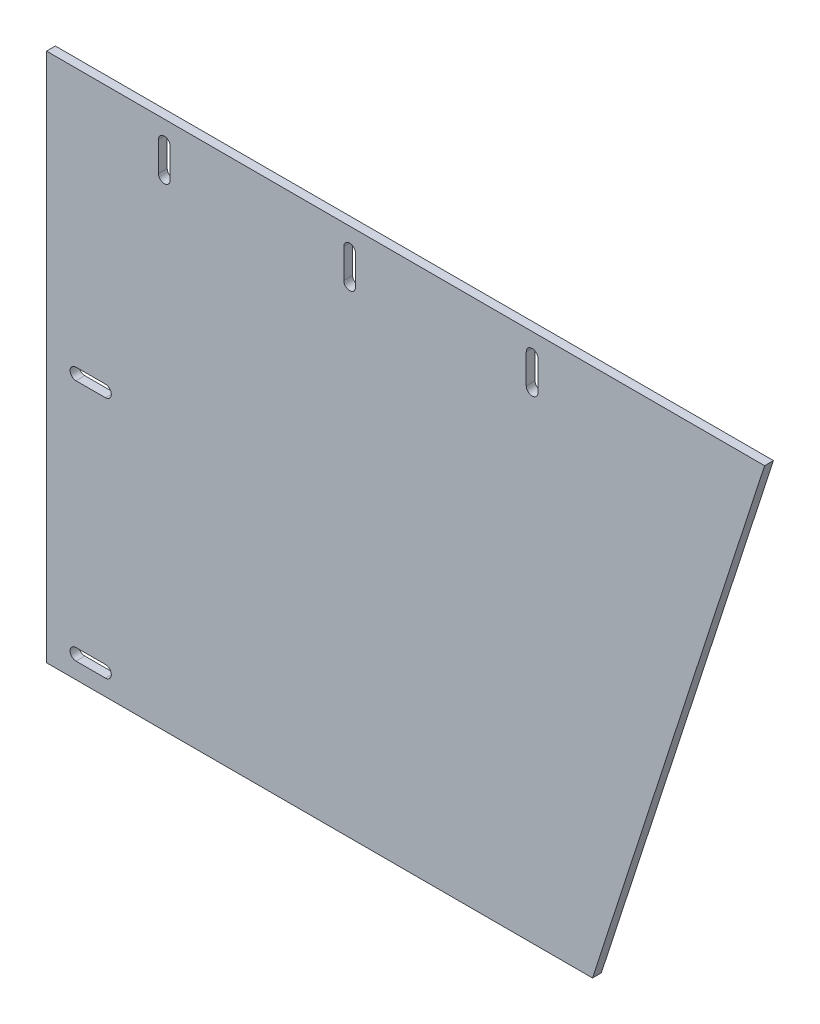
ISO-10303-21;
HEADER;
FILE_DESCRIPTION(('STEP AP214'),'2;1');
FILE_NAME('part.step','',(''),(''),'','','');
FILE_SCHEMA(('AUTOMOTIVE_DESIGN { 1 0 10303 214 1 1 1 1 }'));
ENDSEC;
DATA;
#1=APPLICATION_CONTEXT('core data for automotive mechanical design processes');
#2=APPLICATION_PROTOCOL_DEFINITION('international standard','automotive_design',2000,#1);
#3=PRODUCT_CONTEXT('',#1,'mechanical');
#4=PRODUCT('Part','Part','',(#3));
#5=PRODUCT_RELATED_PRODUCT_CATEGORY('part','',(#4));
#6=PRODUCT_DEFINITION_FORMATION('','',#4);
#7=PRODUCT_DEFINITION_CONTEXT('part definition',#1,'design');
#8=PRODUCT_DEFINITION('design','',#6,#7);
#9=PRODUCT_DEFINITION_SHAPE('','',#8);
#10=(LENGTH_UNIT() NAMED_UNIT(*) SI_UNIT(.MILLI.,.METRE.));
#11=(NAMED_UNIT(*) PLANE_ANGLE_UNIT() SI_UNIT($,.RADIAN.));
#12=(NAMED_UNIT(*) SI_UNIT($,.STERADIAN.) SOLID_ANGLE_UNIT());
#13=UNCERTAINTY_MEASURE_WITH_UNIT(LENGTH_MEASURE(1.E-05),#10,'distance_accuracy_value','');
#14=(GEOMETRIC_REPRESENTATION_CONTEXT(3) GLOBAL_UNCERTAINTY_ASSIGNED_CONTEXT((#13)) GLOBAL_UNIT_ASSIGNED_CONTEXT((#10,
#11,#12)) REPRESENTATION_CONTEXT('',''));
#15=CARTESIAN_POINT('',(0.,0.,0.));
#16=DIRECTION('',(0.,0.,1.));
#17=DIRECTION('',(1.,0.,0.));
#18=AXIS2_PLACEMENT_3D('',#15,#16,#17);
#19=CARTESIAN_POINT('',(-122.,90.,3.));
#20=DIRECTION('',(0.,-1.,0.));
#21=DIRECTION('',(0.,0.,-1.));
#22=AXIS2_PLACEMENT_3D('',#19,#20,#21);
#23=PLANE('',#22);
#24=DIRECTION('',(-1.,0.,0.));
#25=VECTOR('',#24,1.);
#26=CARTESIAN_POINT('',(-122.,90.,0.));
#27=LINE('',#26,#25);
#28=CARTESIAN_POINT('',(122.,90.,0.));
#29=VERTEX_POINT('',#28);
#30=CARTESIAN_POINT('',(-122.,90.,0.));
#31=VERTEX_POINT('',#30);
#32=EDGE_CURVE('E369',#29,#31,#27,.T.);
#33=ORIENTED_EDGE('',*,*,#32,.T.);
#34=DIRECTION('',(0.,0.,-1.));
#35=VECTOR('',#34,1.);
#36=CARTESIAN_POINT('',(-122.,90.,3.));
#37=LINE('',#36,#35);
#38=CARTESIAN_POINT('',(-122.,90.,3.));
#39=VERTEX_POINT('',#38);
#40=EDGE_CURVE('E41',#39,#31,#37,.T.);
#41=ORIENTED_EDGE('',*,*,#40,.F.);
#42=DIRECTION('',(-1.,0.,0.));
#43=VECTOR('',#42,1.);
#44=CARTESIAN_POINT('',(-122.,90.,3.));
#45=LINE('',#44,#43);
#46=CARTESIAN_POINT('',(122.,90.,3.));
#47=VERTEX_POINT('',#46);
#48=EDGE_CURVE('E370',#47,#39,#45,.T.);
#49=ORIENTED_EDGE('',*,*,#48,.F.);
#50=DIRECTION('',(0.,0.,-1.));
#51=VECTOR('',#50,1.);
#52=CARTESIAN_POINT('',(122.,90.,3.));
#53=LINE('',#52,#51);
#54=EDGE_CURVE('E11',#47,#29,#53,.T.);
#55=ORIENTED_EDGE('',*,*,#54,.T.);
#56=EDGE_LOOP('',(#33,#41,#49,#55));
#57=FACE_BOUND('',#56,.T.);
#58=ADVANCED_FACE('F34',(#57),#23,.F.);
#59=CARTESIAN_POINT('',(-122.,90.,3.));
#60=DIRECTION('',(1.,0.,0.));
#61=DIRECTION('',(0.,1.,0.));
#62=AXIS2_PLACEMENT_3D('',#59,#60,#61);
#63=PLANE('',#62);
#64=DIRECTION('',(0.,-1.,0.));
#65=VECTOR('',#64,1.);
#66=CARTESIAN_POINT('',(-122.,90.,0.));
#67=LINE('',#66,#65);
#68=CARTESIAN_POINT('',(-122.,-90.,0.));
#69=VERTEX_POINT('',#68);
#70=EDGE_CURVE('E380',#31,#69,#67,.T.);
#71=ORIENTED_EDGE('',*,*,#70,.T.);
#72=DIRECTION('',(0.,0.,-1.));
#73=VECTOR('',#72,1.);
#74=CARTESIAN_POINT('',(-122.,-90.,3.));
#75=LINE('',#74,#73);
#76=CARTESIAN_POINT('',(-122.,-90.,3.));
#77=VERTEX_POINT('',#76);
#78=EDGE_CURVE('E378',#77,#69,#75,.T.);
#79=ORIENTED_EDGE('',*,*,#78,.F.);
#80=DIRECTION('',(0.,-1.,0.));
#81=VECTOR('',#80,1.);
#82=CARTESIAN_POINT('',(-122.,90.,3.));
#83=LINE('',#82,#81);
#84=EDGE_CURVE('E372',#39,#77,#83,.T.);
#85=ORIENTED_EDGE('',*,*,#84,.F.);
#86=ORIENTED_EDGE('',*,*,#40,.T.);
#87=EDGE_LOOP('',(#71,#79,#85,#86));
#88=FACE_BOUND('',#87,.T.);
#89=ADVANCED_FACE('F390',(#88),#63,.F.);
#90=CARTESIAN_POINT('',(-122.,-90.,3.));
#91=DIRECTION('',(0.,1.,0.));
#92=DIRECTION('',(0.,0.,1.));
#93=AXIS2_PLACEMENT_3D('',#90,#91,#92);
#94=PLANE('',#93);
#95=DIRECTION('',(1.,0.,0.));
#96=VECTOR('',#95,1.);
#97=CARTESIAN_POINT('',(-122.,-90.,0.));
#98=LINE('',#97,#96);
#99=CARTESIAN_POINT('',(63.514454678076,-90.,0.));
#100=VERTEX_POINT('',#99);
#101=EDGE_CURVE('E373',#69,#100,#98,.T.);
#102=ORIENTED_EDGE('',*,*,#101,.T.);
#103=DIRECTION('',(0.,0.,1.));
#104=VECTOR('',#103,1.);
#105=CARTESIAN_POINT('',(63.514454678076,-90.,0.));
#106=LINE('',#105,#104);
#107=CARTESIAN_POINT('',(63.514454678076,-90.,3.));
#108=VERTEX_POINT('',#107);
#109=EDGE_CURVE('E365',#100,#108,#106,.T.);
#110=ORIENTED_EDGE('',*,*,#109,.T.);
#111=DIRECTION('',(1.,0.,0.));
#112=VECTOR('',#111,1.);
#113=CARTESIAN_POINT('',(-122.,-90.,3.));
#114=LINE('',#113,#112);
#115=EDGE_CURVE('E375',#77,#108,#114,.T.);
#116=ORIENTED_EDGE('',*,*,#115,.F.);
#117=ORIENTED_EDGE('',*,*,#78,.T.);
#118=EDGE_LOOP('',(#102,#110,#116,#117));
#119=FACE_BOUND('',#118,.T.);
#120=ADVANCED_FACE('F398',(#119),#94,.F.);
#121=CARTESIAN_POINT('',(0.,0.,3.));
#122=DIRECTION('',(0.,0.,1.));
#123=DIRECTION('',(1.,0.,0.));
#124=AXIS2_PLACEMENT_3D('',#121,#122,#123);
#125=PLANE('',#124);
#126=CARTESIAN_POINT('',(-112.,-82.5,3.));
#127=DIRECTION('',(0.,0.,1.));
#128=DIRECTION('',(1.,0.,0.));
#129=AXIS2_PLACEMENT_3D('',#126,#127,#128);
#130=CIRCLE('',#129,2.00000000000002);
#131=CARTESIAN_POINT('',(-112.,-80.5,3.));
#132=VERTEX_POINT('',#131);
#133=CARTESIAN_POINT('',(-112.,-84.5,3.));
#134=VERTEX_POINT('',#133);
#135=EDGE_CURVE('E48',#132,#134,#130,.T.);
#136=ORIENTED_EDGE('',*,*,#135,.F.);
#137=DIRECTION('',(-1.,0.,0.));
#138=VECTOR('',#137,1.);
#139=CARTESIAN_POINT('',(-112.,-80.5,3.));
#140=LINE('',#139,#138);
#141=CARTESIAN_POINT('',(-102.,-80.5,3.));
#142=VERTEX_POINT('',#141);
#143=EDGE_CURVE('E305',#142,#132,#140,.T.);
#144=ORIENTED_EDGE('',*,*,#143,.F.);
#145=CARTESIAN_POINT('',(-102.,-82.5,3.));
#146=DIRECTION('',(0.,0.,1.));
#147=DIRECTION('',(1.,0.,0.));
#148=AXIS2_PLACEMENT_3D('',#145,#146,#147);
#149=CIRCLE('',#148,2.00000000000002);
#150=CARTESIAN_POINT('',(-102.,-84.5,3.));
#151=VERTEX_POINT('',#150);
#152=EDGE_CURVE('E319',#151,#142,#149,.T.);
#153=ORIENTED_EDGE('',*,*,#152,.F.);
#154=DIRECTION('',(1.,0.,0.));
#155=VECTOR('',#154,1.);
#156=CARTESIAN_POINT('',(-112.,-84.5,3.));
#157=LINE('',#156,#155);
#158=EDGE_CURVE('E316',#134,#151,#157,.T.);
#159=ORIENTED_EDGE('',*,*,#158,.F.);
#160=EDGE_LOOP('',(#136,#144,#153,#159));
#161=FACE_BOUND('',#160,.T.);
#162=CARTESIAN_POINT('',(-112.,0.,3.));
#163=DIRECTION('',(0.,0.,1.));
#164=DIRECTION('',(1.,0.,0.));
#165=AXIS2_PLACEMENT_3D('',#162,#163,#164);
#166=CIRCLE('',#165,2.);
#167=CARTESIAN_POINT('',(-112.,2.00000000000001,3.));
#168=VERTEX_POINT('',#167);
#169=CARTESIAN_POINT('',(-112.,-1.99999999999999,3.));
#170=VERTEX_POINT('',#169);
#171=EDGE_CURVE('E56',#168,#170,#166,.T.);
#172=ORIENTED_EDGE('',*,*,#171,.F.);
#173=DIRECTION('',(-1.,0.,0.));
#174=VECTOR('',#173,1.);
#175=CARTESIAN_POINT('',(-112.,2.00000000000001,3.));
#176=LINE('',#175,#174);
#177=CARTESIAN_POINT('',(-102.,2.00000000000001,3.));
#178=VERTEX_POINT('',#177);
#179=EDGE_CURVE('E275',#178,#168,#176,.T.);
#180=ORIENTED_EDGE('',*,*,#179,.F.);
#181=CARTESIAN_POINT('',(-102.,0.,3.));
#182=DIRECTION('',(0.,0.,1.));
#183=DIRECTION('',(1.,0.,0.));
#184=AXIS2_PLACEMENT_3D('',#181,#182,#183);
#185=CIRCLE('',#184,2.);
#186=CARTESIAN_POINT('',(-102.,-1.99999999999999,3.));
#187=VERTEX_POINT('',#186);
#188=EDGE_CURVE('E290',#187,#178,#185,.T.);
#189=ORIENTED_EDGE('',*,*,#188,.F.);
#190=DIRECTION('',(1.,0.,0.));
#191=VECTOR('',#190,1.);
#192=CARTESIAN_POINT('',(-112.,-1.99999999999999,3.));
#193=LINE('',#192,#191);
#194=EDGE_CURVE('E286',#170,#187,#193,.T.);
#195=ORIENTED_EDGE('',*,*,#194,.F.);
#196=EDGE_LOOP('',(#172,#180,#189,#195));
#197=FACE_BOUND('',#196,.T.);
#198=CARTESIAN_POINT('',(43.,83.,3.));
#199=DIRECTION('',(0.,0.,1.));
#200=DIRECTION('',(1.,0.,0.));
#201=AXIS2_PLACEMENT_3D('',#198,#199,#200);
#202=CIRCLE('',#201,2.00000000000001);
#203=CARTESIAN_POINT('',(45.,83.,3.));
#204=VERTEX_POINT('',#203);
#205=CARTESIAN_POINT('',(40.9999999999999,83.,3.));
#206=VERTEX_POINT('',#205);
#207=EDGE_CURVE('E253',#204,#206,#202,.T.);
#208=ORIENTED_EDGE('',*,*,#207,.F.);
#209=DIRECTION('',(0.,1.,0.));
#210=VECTOR('',#209,1.);
#211=CARTESIAN_POINT('',(45.,83.,3.));
#212=LINE('',#211,#210);
#213=CARTESIAN_POINT('',(45.,73.,3.));
#214=VERTEX_POINT('',#213);
#215=EDGE_CURVE('E243',#214,#204,#212,.T.);
#216=ORIENTED_EDGE('',*,*,#215,.F.);
#217=CARTESIAN_POINT('',(43.,73.,3.));
#218=DIRECTION('',(0.,0.,1.));
#219=DIRECTION('',(1.,0.,0.));
#220=AXIS2_PLACEMENT_3D('',#217,#218,#219);
#221=CIRCLE('',#220,2.00000000000001);
#222=CARTESIAN_POINT('',(40.9999999999999,73.,3.));
#223=VERTEX_POINT('',#222);
#224=EDGE_CURVE('E259',#223,#214,#221,.T.);
#225=ORIENTED_EDGE('',*,*,#224,.F.);
#226=DIRECTION('',(0.,-1.,0.));
#227=VECTOR('',#226,1.);
#228=CARTESIAN_POINT('',(40.9999999999999,83.,3.));
#229=LINE('',#228,#227);
#230=EDGE_CURVE('E255',#206,#223,#229,.T.);
#231=ORIENTED_EDGE('',*,*,#230,.F.);
#232=EDGE_LOOP('',(#208,#216,#225,#231));
#233=FACE_BOUND('',#232,.T.);
#234=CARTESIAN_POINT('',(-19.0000000000001,83.,3.));
#235=DIRECTION('',(0.,0.,1.));
#236=DIRECTION('',(1.,0.,0.));
#237=AXIS2_PLACEMENT_3D('',#234,#235,#236);
#238=CIRCLE('',#237,1.99999999999999);
#239=CARTESIAN_POINT('',(-17.0000000000001,83.,3.));
#240=VERTEX_POINT('',#239);
#241=CARTESIAN_POINT('',(-21.,83.,3.));
#242=VERTEX_POINT('',#241);
#243=EDGE_CURVE('E201',#240,#242,#238,.T.);
#244=ORIENTED_EDGE('',*,*,#243,.F.);
#245=DIRECTION('',(0.,1.,0.));
#246=VECTOR('',#245,1.);
#247=CARTESIAN_POINT('',(-17.0000000000001,83.,3.));
#248=LINE('',#247,#246);
#249=CARTESIAN_POINT('',(-17.0000000000001,73.,3.));
#250=VERTEX_POINT('',#249);
#251=EDGE_CURVE('E219',#250,#240,#248,.T.);
#252=ORIENTED_EDGE('',*,*,#251,.F.);
#253=CARTESIAN_POINT('',(-19.0000000000001,73.,3.));
#254=DIRECTION('',(0.,0.,1.));
#255=DIRECTION('',(1.,0.,0.));
#256=AXIS2_PLACEMENT_3D('',#253,#254,#255);
#257=CIRCLE('',#256,1.99999999999999);
#258=CARTESIAN_POINT('',(-21.,73.,3.));
#259=VERTEX_POINT('',#258);
#260=EDGE_CURVE('E222',#259,#250,#257,.T.);
#261=ORIENTED_EDGE('',*,*,#260,.F.);
#262=DIRECTION('',(0.,-1.,0.));
#263=VECTOR('',#262,1.);
#264=CARTESIAN_POINT('',(-21.,83.,3.));
#265=LINE('',#264,#263);
#266=EDGE_CURVE('E228',#242,#259,#265,.T.);
#267=ORIENTED_EDGE('',*,*,#266,.F.);
#268=EDGE_LOOP('',(#244,#252,#261,#267));
#269=FACE_BOUND('',#268,.T.);
#270=CARTESIAN_POINT('',(-82.,83.,3.));
#271=DIRECTION('',(0.,0.,1.));
#272=DIRECTION('',(1.,0.,0.));
#273=AXIS2_PLACEMENT_3D('',#270,#271,#272);
#274=CIRCLE('',#273,2.);
#275=CARTESIAN_POINT('',(-80.,83.,3.));
#276=VERTEX_POINT('',#275);
#277=CARTESIAN_POINT('',(-84.,83.,3.));
#278=VERTEX_POINT('',#277);
#279=EDGE_CURVE('E235',#276,#278,#274,.T.);
#280=ORIENTED_EDGE('',*,*,#279,.F.);
#281=DIRECTION('',(0.,1.,0.));
#282=VECTOR('',#281,1.);
#283=CARTESIAN_POINT('',(-80.,83.,3.));
#284=LINE('',#283,#282);
#285=CARTESIAN_POINT('',(-80.,73.,3.));
#286=VERTEX_POINT('',#285);
#287=EDGE_CURVE('E334',#286,#276,#284,.T.);
#288=ORIENTED_EDGE('',*,*,#287,.F.);
#289=CARTESIAN_POINT('',(-82.,73.,3.));
#290=DIRECTION('',(0.,0.,1.));
#291=DIRECTION('',(1.,0.,0.));
#292=AXIS2_PLACEMENT_3D('',#289,#290,#291);
#293=CIRCLE('',#292,2.00000000000002);
#294=CARTESIAN_POINT('',(-84.0000000000001,73.,3.));
#295=VERTEX_POINT('',#294);
#296=EDGE_CURVE('E348',#295,#286,#293,.T.);
#297=ORIENTED_EDGE('',*,*,#296,.F.);
#298=DIRECTION('',(0.,-1.,0.));
#299=VECTOR('',#298,1.);
#300=CARTESIAN_POINT('',(-84.,83.,3.));
#301=LINE('',#300,#299);
#302=EDGE_CURVE('E345',#278,#295,#301,.T.);
#303=ORIENTED_EDGE('',*,*,#302,.F.);
#304=EDGE_LOOP('',(#280,#288,#297,#303));
#305=FACE_BOUND('',#304,.T.);
#306=DIRECTION('',(-0.309016994374951,-0.951056516295152,0.));
#307=VECTOR('',#306,1.);
#308=CARTESIAN_POINT('',(122.,90.,3.));
#309=LINE('',#308,#307);
#310=EDGE_CURVE('E355',#47,#108,#309,.T.);
#311=ORIENTED_EDGE('',*,*,#310,.F.);
#312=ORIENTED_EDGE('',*,*,#48,.T.);
#313=ORIENTED_EDGE('',*,*,#84,.T.);
#314=ORIENTED_EDGE('',*,*,#115,.T.);
#315=EDGE_LOOP('',(#311,#312,#313,#314));
#316=FACE_BOUND('',#315,.T.);
#317=ADVANCED_FACE('F402',(#161,#197,#233,#269,#305,#316),#125,.T.);
#318=CARTESIAN_POINT('',(0.,0.,0.));
#319=DIRECTION('',(0.,0.,1.));
#320=DIRECTION('',(1.,0.,0.));
#321=AXIS2_PLACEMENT_3D('',#318,#319,#320);
#322=PLANE('',#321);
#323=DIRECTION('',(-1.,0.,0.));
#324=VECTOR('',#323,1.);
#325=CARTESIAN_POINT('',(-112.,-80.5,0.));
#326=LINE('',#325,#324);
#327=CARTESIAN_POINT('',(-102.,-80.5,0.));
#328=VERTEX_POINT('',#327);
#329=CARTESIAN_POINT('',(-112.,-80.5,0.));
#330=VERTEX_POINT('',#329);
#331=EDGE_CURVE('E311',#328,#330,#326,.T.);
#332=ORIENTED_EDGE('',*,*,#331,.T.);
#333=CARTESIAN_POINT('',(-112.,-82.5,0.));
#334=DIRECTION('',(0.,0.,1.));
#335=DIRECTION('',(1.,0.,0.));
#336=AXIS2_PLACEMENT_3D('',#333,#334,#335);
#337=CIRCLE('',#336,2.00000000000002);
#338=CARTESIAN_POINT('',(-112.,-84.5,0.));
#339=VERTEX_POINT('',#338);
#340=EDGE_CURVE('E301',#330,#339,#337,.T.);
#341=ORIENTED_EDGE('',*,*,#340,.T.);
#342=DIRECTION('',(1.,0.,0.));
#343=VECTOR('',#342,1.);
#344=CARTESIAN_POINT('',(-112.,-84.5,0.));
#345=LINE('',#344,#343);
#346=CARTESIAN_POINT('',(-102.,-84.5,0.));
#347=VERTEX_POINT('',#346);
#348=EDGE_CURVE('E304',#339,#347,#345,.T.);
#349=ORIENTED_EDGE('',*,*,#348,.T.);
#350=CARTESIAN_POINT('',(-102.,-82.5,0.));
#351=DIRECTION('',(0.,0.,1.));
#352=DIRECTION('',(1.,0.,0.));
#353=AXIS2_PLACEMENT_3D('',#350,#351,#352);
#354=CIRCLE('',#353,2.00000000000002);
#355=EDGE_CURVE('E308',#347,#328,#354,.T.);
#356=ORIENTED_EDGE('',*,*,#355,.T.);
#357=EDGE_LOOP('',(#332,#341,#349,#356));
#358=FACE_BOUND('',#357,.T.);
#359=DIRECTION('',(-1.,0.,0.));
#360=VECTOR('',#359,1.);
#361=CARTESIAN_POINT('',(-112.,2.00000000000001,0.));
#362=LINE('',#361,#360);
#363=CARTESIAN_POINT('',(-102.,2.00000000000001,0.));
#364=VERTEX_POINT('',#363);
#365=CARTESIAN_POINT('',(-112.,2.00000000000001,0.));
#366=VERTEX_POINT('',#365);
#367=EDGE_CURVE('E281',#364,#366,#362,.T.);
#368=ORIENTED_EDGE('',*,*,#367,.T.);
#369=CARTESIAN_POINT('',(-112.,0.,0.));
#370=DIRECTION('',(0.,0.,1.));
#371=DIRECTION('',(1.,0.,0.));
#372=AXIS2_PLACEMENT_3D('',#369,#370,#371);
#373=CIRCLE('',#372,2.);
#374=CARTESIAN_POINT('',(-112.,-1.99999999999999,0.));
#375=VERTEX_POINT('',#374);
#376=EDGE_CURVE('E271',#366,#375,#373,.T.);
#377=ORIENTED_EDGE('',*,*,#376,.T.);
#378=DIRECTION('',(1.,0.,0.));
#379=VECTOR('',#378,1.);
#380=CARTESIAN_POINT('',(-112.,-1.99999999999999,0.));
#381=LINE('',#380,#379);
#382=CARTESIAN_POINT('',(-102.,-1.99999999999999,0.));
#383=VERTEX_POINT('',#382);
#384=EDGE_CURVE('E274',#375,#383,#381,.T.);
#385=ORIENTED_EDGE('',*,*,#384,.T.);
#386=CARTESIAN_POINT('',(-102.,0.,0.));
#387=DIRECTION('',(0.,0.,1.));
#388=DIRECTION('',(1.,0.,0.));
#389=AXIS2_PLACEMENT_3D('',#386,#387,#388);
#390=CIRCLE('',#389,2.);
#391=EDGE_CURVE('E278',#383,#364,#390,.T.);
#392=ORIENTED_EDGE('',*,*,#391,.T.);
#393=EDGE_LOOP('',(#368,#377,#385,#392));
#394=FACE_BOUND('',#393,.T.);
#395=DIRECTION('',(0.,1.,0.));
#396=VECTOR('',#395,1.);
#397=CARTESIAN_POINT('',(45.,83.,0.));
#398=LINE('',#397,#396);
#399=CARTESIAN_POINT('',(45.,73.,0.));
#400=VERTEX_POINT('',#399);
#401=CARTESIAN_POINT('',(45.,83.,0.));
#402=VERTEX_POINT('',#401);
#403=EDGE_CURVE('E249',#400,#402,#398,.T.);
#404=ORIENTED_EDGE('',*,*,#403,.T.);
#405=CARTESIAN_POINT('',(43.,83.,0.));
#406=DIRECTION('',(0.,0.,1.));
#407=DIRECTION('',(1.,0.,0.));
#408=AXIS2_PLACEMENT_3D('',#405,#406,#407);
#409=CIRCLE('',#408,2.00000000000001);
#410=CARTESIAN_POINT('',(40.9999999999999,83.,0.));
#411=VERTEX_POINT('',#410);
#412=EDGE_CURVE('E239',#402,#411,#409,.T.);
#413=ORIENTED_EDGE('',*,*,#412,.T.);
#414=DIRECTION('',(0.,-1.,0.));
#415=VECTOR('',#414,1.);
#416=CARTESIAN_POINT('',(40.9999999999999,83.,0.));
#417=LINE('',#416,#415);
#418=CARTESIAN_POINT('',(40.9999999999999,73.,0.));
#419=VERTEX_POINT('',#418);
#420=EDGE_CURVE('E242',#411,#419,#417,.T.);
#421=ORIENTED_EDGE('',*,*,#420,.T.);
#422=CARTESIAN_POINT('',(43.,73.,0.));
#423=DIRECTION('',(0.,0.,1.));
#424=DIRECTION('',(1.,0.,0.));
#425=AXIS2_PLACEMENT_3D('',#422,#423,#424);
#426=CIRCLE('',#425,2.00000000000001);
#427=EDGE_CURVE('E246',#419,#400,#426,.T.);
#428=ORIENTED_EDGE('',*,*,#427,.T.);
#429=EDGE_LOOP('',(#404,#413,#421,#428));
#430=FACE_BOUND('',#429,.T.);
#431=DIRECTION('',(0.,1.,0.));
#432=VECTOR('',#431,1.);
#433=CARTESIAN_POINT('',(-17.0000000000001,83.,0.));
#434=LINE('',#433,#432);
#435=CARTESIAN_POINT('',(-17.0000000000001,73.,0.));
#436=VERTEX_POINT('',#435);
#437=CARTESIAN_POINT('',(-17.0000000000001,83.,0.));
#438=VERTEX_POINT('',#437);
#439=EDGE_CURVE('E206',#436,#438,#434,.T.);
#440=ORIENTED_EDGE('',*,*,#439,.T.);
#441=CARTESIAN_POINT('',(-19.0000000000001,83.,0.));
#442=DIRECTION('',(0.,0.,1.));
#443=DIRECTION('',(1.,0.,0.));
#444=AXIS2_PLACEMENT_3D('',#441,#442,#443);
#445=CIRCLE('',#444,1.99999999999999);
#446=CARTESIAN_POINT('',(-21.,83.,0.));
#447=VERTEX_POINT('',#446);
#448=EDGE_CURVE('E198',#438,#447,#445,.T.);
#449=ORIENTED_EDGE('',*,*,#448,.T.);
#450=DIRECTION('',(0.,-1.,0.));
#451=VECTOR('',#450,1.);
#452=CARTESIAN_POINT('',(-21.,83.,0.));
#453=LINE('',#452,#451);
#454=CARTESIAN_POINT('',(-21.,73.,0.));
#455=VERTEX_POINT('',#454);
#456=EDGE_CURVE('E210',#447,#455,#453,.T.);
#457=ORIENTED_EDGE('',*,*,#456,.T.);
#458=CARTESIAN_POINT('',(-19.0000000000001,73.,0.));
#459=DIRECTION('',(0.,0.,1.));
#460=DIRECTION('',(1.,0.,0.));
#461=AXIS2_PLACEMENT_3D('',#458,#459,#460);
#462=CIRCLE('',#461,1.99999999999999);
#463=EDGE_CURVE('E214',#455,#436,#462,.T.);
#464=ORIENTED_EDGE('',*,*,#463,.T.);
#465=EDGE_LOOP('',(#440,#449,#457,#464));
#466=FACE_BOUND('',#465,.T.);
#467=DIRECTION('',(0.,1.,0.));
#468=VECTOR('',#467,1.);
#469=CARTESIAN_POINT('',(-80.,83.,0.));
#470=LINE('',#469,#468);
#471=CARTESIAN_POINT('',(-80.,73.,0.));
#472=VERTEX_POINT('',#471);
#473=CARTESIAN_POINT('',(-80.,83.,0.));
#474=VERTEX_POINT('',#473);
#475=EDGE_CURVE('E340',#472,#474,#470,.T.);
#476=ORIENTED_EDGE('',*,*,#475,.T.);
#477=CARTESIAN_POINT('',(-82.,83.,0.));
#478=DIRECTION('',(0.,0.,1.));
#479=DIRECTION('',(1.,0.,0.));
#480=AXIS2_PLACEMENT_3D('',#477,#478,#479);
#481=CIRCLE('',#480,2.);
#482=CARTESIAN_POINT('',(-84.,83.,0.));
#483=VERTEX_POINT('',#482);
#484=EDGE_CURVE('E330',#474,#483,#481,.T.);
#485=ORIENTED_EDGE('',*,*,#484,.T.);
#486=DIRECTION('',(0.,-1.,0.));
#487=VECTOR('',#486,1.);
#488=CARTESIAN_POINT('',(-84.,83.,0.));
#489=LINE('',#488,#487);
#490=CARTESIAN_POINT('',(-84.0000000000001,73.,0.));
#491=VERTEX_POINT('',#490);
#492=EDGE_CURVE('E333',#483,#491,#489,.T.);
#493=ORIENTED_EDGE('',*,*,#492,.T.);
#494=CARTESIAN_POINT('',(-82.,73.,0.));
#495=DIRECTION('',(0.,0.,1.));
#496=DIRECTION('',(1.,0.,0.));
#497=AXIS2_PLACEMENT_3D('',#494,#495,#496);
#498=CIRCLE('',#497,2.00000000000002);
#499=EDGE_CURVE('E337',#491,#472,#498,.T.);
#500=ORIENTED_EDGE('',*,*,#499,.T.);
#501=EDGE_LOOP('',(#476,#485,#493,#500));
#502=FACE_BOUND('',#501,.T.);
#503=ORIENTED_EDGE('',*,*,#32,.F.);
#504=DIRECTION('',(-0.309016994374951,-0.951056516295152,0.));
#505=VECTOR('',#504,1.);
#506=CARTESIAN_POINT('',(122.,90.,0.));
#507=LINE('',#506,#505);
#508=EDGE_CURVE('E362',#29,#100,#507,.T.);
#509=ORIENTED_EDGE('',*,*,#508,.T.);
#510=ORIENTED_EDGE('',*,*,#101,.F.);
#511=ORIENTED_EDGE('',*,*,#70,.F.);
#512=EDGE_LOOP('',(#503,#509,#510,#511));
#513=FACE_BOUND('',#512,.T.);
#514=ADVANCED_FACE('F216',(#358,#394,#430,#466,#502,#513),#322,.F.);
#515=CARTESIAN_POINT('',(122.,90.,0.));
#516=DIRECTION('',(-0.951056516295152,0.309016994374951,0.));
#517=DIRECTION('',(-0.309016994374951,-0.951056516295153,0.));
#518=AXIS2_PLACEMENT_3D('',#515,#516,#517);
#519=PLANE('',#518);
#520=ORIENTED_EDGE('',*,*,#310,.T.);
#521=ORIENTED_EDGE('',*,*,#109,.F.);
#522=ORIENTED_EDGE('',*,*,#508,.F.);
#523=ORIENTED_EDGE('',*,*,#54,.F.);
#524=EDGE_LOOP('',(#520,#521,#522,#523));
#525=FACE_BOUND('',#524,.T.);
#526=ADVANCED_FACE('F404',(#525),#519,.F.);
#527=CARTESIAN_POINT('',(-82.,83.,0.));
#528=DIRECTION('',(0.,0.,1.));
#529=DIRECTION('',(1.,0.,0.));
#530=AXIS2_PLACEMENT_3D('',#527,#528,#529);
#531=CYLINDRICAL_SURFACE('',#530,2.);
#532=ORIENTED_EDGE('',*,*,#279,.T.);
#533=DIRECTION('',(0.,0.,1.));
#534=VECTOR('',#533,1.);
#535=CARTESIAN_POINT('',(-84.,83.,0.));
#536=LINE('',#535,#534);
#537=EDGE_CURVE('E343',#483,#278,#536,.T.);
#538=ORIENTED_EDGE('',*,*,#537,.F.);
#539=ORIENTED_EDGE('',*,*,#484,.F.);
#540=DIRECTION('',(0.,0.,1.));
#541=VECTOR('',#540,1.);
#542=CARTESIAN_POINT('',(-80.,83.,0.));
#543=LINE('',#542,#541);
#544=EDGE_CURVE('E353',#474,#276,#543,.T.);
#545=ORIENTED_EDGE('',*,*,#544,.T.);
#546=EDGE_LOOP('',(#532,#538,#539,#545));
#547=FACE_BOUND('',#546,.T.);
#548=ADVANCED_FACE('F406',(#547),#531,.F.);
#549=CARTESIAN_POINT('',(-80.,83.,0.));
#550=DIRECTION('',(1.,0.,0.));
#551=DIRECTION('',(0.,1.,0.));
#552=AXIS2_PLACEMENT_3D('',#549,#550,#551);
#553=PLANE('',#552);
#554=ORIENTED_EDGE('',*,*,#287,.T.);
#555=ORIENTED_EDGE('',*,*,#544,.F.);
#556=ORIENTED_EDGE('',*,*,#475,.F.);
#557=DIRECTION('',(0.,0.,1.));
#558=VECTOR('',#557,1.);
#559=CARTESIAN_POINT('',(-80.,73.,0.));
#560=LINE('',#559,#558);
#561=EDGE_CURVE('E356',#472,#286,#560,.T.);
#562=ORIENTED_EDGE('',*,*,#561,.T.);
#563=EDGE_LOOP('',(#554,#555,#556,#562));
#564=FACE_BOUND('',#563,.T.);
#565=ADVANCED_FACE('F412',(#564),#553,.F.);
#566=CARTESIAN_POINT('',(-82.,73.,0.));
#567=DIRECTION('',(0.,0.,1.));
#568=DIRECTION('',(1.,0.,0.));
#569=AXIS2_PLACEMENT_3D('',#566,#567,#568);
#570=CYLINDRICAL_SURFACE('',#569,2.00000000000002);
#571=ORIENTED_EDGE('',*,*,#296,.T.);
#572=ORIENTED_EDGE('',*,*,#561,.F.);
#573=ORIENTED_EDGE('',*,*,#499,.F.);
#574=DIRECTION('',(0.,0.,1.));
#575=VECTOR('',#574,1.);
#576=CARTESIAN_POINT('',(-84.0000000000001,73.,0.));
#577=LINE('',#576,#575);
#578=EDGE_CURVE('E358',#491,#295,#577,.T.);
#579=ORIENTED_EDGE('',*,*,#578,.T.);
#580=EDGE_LOOP('',(#571,#572,#573,#579));
#581=FACE_BOUND('',#580,.T.);
#582=ADVANCED_FACE('F454',(#581),#570,.F.);
#583=CARTESIAN_POINT('',(-84.,83.,0.));
#584=DIRECTION('',(-1.,0.,0.));
#585=DIRECTION('',(0.,-1.,0.));
#586=AXIS2_PLACEMENT_3D('',#583,#584,#585);
#587=PLANE('',#586);
#588=ORIENTED_EDGE('',*,*,#302,.T.);
#589=ORIENTED_EDGE('',*,*,#578,.F.);
#590=ORIENTED_EDGE('',*,*,#492,.F.);
#591=ORIENTED_EDGE('',*,*,#537,.T.);
#592=EDGE_LOOP('',(#588,#589,#590,#591));
#593=FACE_BOUND('',#592,.T.);
#594=ADVANCED_FACE('F449',(#593),#587,.F.);
#595=CARTESIAN_POINT('',(-19.0000000000001,83.,0.));
#596=DIRECTION('',(0.,0.,1.));
#597=DIRECTION('',(1.,0.,0.));
#598=AXIS2_PLACEMENT_3D('',#595,#596,#597);
#599=CYLINDRICAL_SURFACE('',#598,1.99999999999999);
#600=ORIENTED_EDGE('',*,*,#243,.T.);
#601=DIRECTION('',(0.,0.,1.));
#602=VECTOR('',#601,1.);
#603=CARTESIAN_POINT('',(-21.,83.,0.));
#604=LINE('',#603,#602);
#605=EDGE_CURVE('E194',#447,#242,#604,.T.);
#606=ORIENTED_EDGE('',*,*,#605,.F.);
#607=ORIENTED_EDGE('',*,*,#448,.F.);
#608=DIRECTION('',(0.,0.,1.));
#609=VECTOR('',#608,1.);
#610=CARTESIAN_POINT('',(-17.0000000000001,83.,0.));
#611=LINE('',#610,#609);
#612=EDGE_CURVE('E233',#438,#240,#611,.T.);
#613=ORIENTED_EDGE('',*,*,#612,.T.);
#614=EDGE_LOOP('',(#600,#606,#607,#613));
#615=FACE_BOUND('',#614,.T.);
#616=ADVANCED_FACE('F196',(#615),#599,.F.);
#617=CARTESIAN_POINT('',(-17.0000000000001,83.,0.));
#618=DIRECTION('',(1.,0.,0.));
#619=DIRECTION('',(0.,0.,-1.));
#620=AXIS2_PLACEMENT_3D('',#617,#618,#619);
#621=PLANE('',#620);
#622=ORIENTED_EDGE('',*,*,#251,.T.);
#623=ORIENTED_EDGE('',*,*,#612,.F.);
#624=ORIENTED_EDGE('',*,*,#439,.F.);
#625=DIRECTION('',(0.,0.,1.));
#626=VECTOR('',#625,1.);
#627=CARTESIAN_POINT('',(-17.0000000000001,73.,0.));
#628=LINE('',#627,#626);
#629=EDGE_CURVE('E236',#436,#250,#628,.T.);
#630=ORIENTED_EDGE('',*,*,#629,.T.);
#631=EDGE_LOOP('',(#622,#623,#624,#630));
#632=FACE_BOUND('',#631,.T.);
#633=ADVANCED_FACE('F512',(#632),#621,.F.);
#634=CARTESIAN_POINT('',(-19.0000000000001,73.,0.));
#635=DIRECTION('',(0.,0.,1.));
#636=DIRECTION('',(1.,0.,0.));
#637=AXIS2_PLACEMENT_3D('',#634,#635,#636);
#638=CYLINDRICAL_SURFACE('',#637,1.99999999999999);
#639=ORIENTED_EDGE('',*,*,#260,.T.);
#640=ORIENTED_EDGE('',*,*,#629,.F.);
#641=ORIENTED_EDGE('',*,*,#463,.F.);
#642=DIRECTION('',(0.,0.,1.));
#643=VECTOR('',#642,1.);
#644=CARTESIAN_POINT('',(-21.,73.,0.));
#645=LINE('',#644,#643);
#646=EDGE_CURVE('E205',#455,#259,#645,.T.);
#647=ORIENTED_EDGE('',*,*,#646,.T.);
#648=EDGE_LOOP('',(#639,#640,#641,#647));
#649=FACE_BOUND('',#648,.T.);
#650=ADVANCED_FACE('F515',(#649),#638,.F.);
#651=CARTESIAN_POINT('',(-21.,83.,0.));
#652=DIRECTION('',(-1.,0.,0.));
#653=DIRECTION('',(0.,-1.,0.));
#654=AXIS2_PLACEMENT_3D('',#651,#652,#653);
#655=PLANE('',#654);
#656=ORIENTED_EDGE('',*,*,#266,.T.);
#657=ORIENTED_EDGE('',*,*,#646,.F.);
#658=ORIENTED_EDGE('',*,*,#456,.F.);
#659=ORIENTED_EDGE('',*,*,#605,.T.);
#660=EDGE_LOOP('',(#656,#657,#658,#659));
#661=FACE_BOUND('',#660,.T.);
#662=ADVANCED_FACE('F211',(#661),#655,.F.);
#663=CARTESIAN_POINT('',(43.,83.,0.));
#664=DIRECTION('',(0.,0.,1.));
#665=DIRECTION('',(1.,0.,0.));
#666=AXIS2_PLACEMENT_3D('',#663,#664,#665);
#667=CYLINDRICAL_SURFACE('',#666,2.00000000000001);
#668=ORIENTED_EDGE('',*,*,#207,.T.);
#669=DIRECTION('',(0.,0.,1.));
#670=VECTOR('',#669,1.);
#671=CARTESIAN_POINT('',(40.9999999999999,83.,0.));
#672=LINE('',#671,#670);
#673=EDGE_CURVE('E252',#411,#206,#672,.T.);
#674=ORIENTED_EDGE('',*,*,#673,.F.);
#675=ORIENTED_EDGE('',*,*,#412,.F.);
#676=DIRECTION('',(0.,0.,1.));
#677=VECTOR('',#676,1.);
#678=CARTESIAN_POINT('',(45.,83.,0.));
#679=LINE('',#678,#677);
#680=EDGE_CURVE('E229',#402,#204,#679,.T.);
#681=ORIENTED_EDGE('',*,*,#680,.T.);
#682=EDGE_LOOP('',(#668,#674,#675,#681));
#683=FACE_BOUND('',#682,.T.);
#684=ADVANCED_FACE('F495',(#683),#667,.F.);
#685=CARTESIAN_POINT('',(45.,83.,0.));
#686=DIRECTION('',(1.,0.,0.));
#687=DIRECTION('',(0.,0.,-1.));
#688=AXIS2_PLACEMENT_3D('',#685,#686,#687);
#689=PLANE('',#688);
#690=ORIENTED_EDGE('',*,*,#215,.T.);
#691=ORIENTED_EDGE('',*,*,#680,.F.);
#692=ORIENTED_EDGE('',*,*,#403,.F.);
#693=DIRECTION('',(0.,0.,1.));
#694=VECTOR('',#693,1.);
#695=CARTESIAN_POINT('',(45.,73.,0.));
#696=LINE('',#695,#694);
#697=EDGE_CURVE('E265',#400,#214,#696,.T.);
#698=ORIENTED_EDGE('',*,*,#697,.T.);
#699=EDGE_LOOP('',(#690,#691,#692,#698));
#700=FACE_BOUND('',#699,.T.);
#701=ADVANCED_FACE('F498',(#700),#689,.F.);
#702=CARTESIAN_POINT('',(43.,73.,0.));
#703=DIRECTION('',(0.,0.,1.));
#704=DIRECTION('',(1.,0.,0.));
#705=AXIS2_PLACEMENT_3D('',#702,#703,#704);
#706=CYLINDRICAL_SURFACE('',#705,2.00000000000001);
#707=ORIENTED_EDGE('',*,*,#224,.T.);
#708=ORIENTED_EDGE('',*,*,#697,.F.);
#709=ORIENTED_EDGE('',*,*,#427,.F.);
#710=DIRECTION('',(0.,0.,1.));
#711=VECTOR('',#710,1.);
#712=CARTESIAN_POINT('',(40.9999999999999,73.,0.));
#713=LINE('',#712,#711);
#714=EDGE_CURVE('E267',#419,#223,#713,.T.);
#715=ORIENTED_EDGE('',*,*,#714,.T.);
#716=EDGE_LOOP('',(#707,#708,#709,#715));
#717=FACE_BOUND('',#716,.T.);
#718=ADVANCED_FACE('F502',(#717),#706,.F.);
#719=CARTESIAN_POINT('',(40.9999999999999,83.,0.));
#720=DIRECTION('',(-1.,0.,0.));
#721=DIRECTION('',(0.,0.,1.));
#722=AXIS2_PLACEMENT_3D('',#719,#720,#721);
#723=PLANE('',#722);
#724=ORIENTED_EDGE('',*,*,#230,.T.);
#725=ORIENTED_EDGE('',*,*,#714,.F.);
#726=ORIENTED_EDGE('',*,*,#420,.F.);
#727=ORIENTED_EDGE('',*,*,#673,.T.);
#728=EDGE_LOOP('',(#724,#725,#726,#727));
#729=FACE_BOUND('',#728,.T.);
#730=ADVANCED_FACE('F484',(#729),#723,.F.);
#731=CARTESIAN_POINT('',(-112.,0.,0.));
#732=DIRECTION('',(0.,0.,1.));
#733=DIRECTION('',(1.,0.,0.));
#734=AXIS2_PLACEMENT_3D('',#731,#732,#733);
#735=CYLINDRICAL_SURFACE('',#734,2.);
#736=ORIENTED_EDGE('',*,*,#171,.T.);
#737=DIRECTION('',(0.,0.,1.));
#738=VECTOR('',#737,1.);
#739=CARTESIAN_POINT('',(-112.,-1.99999999999999,0.));
#740=LINE('',#739,#738);
#741=EDGE_CURVE('E284',#375,#170,#740,.T.);
#742=ORIENTED_EDGE('',*,*,#741,.F.);
#743=ORIENTED_EDGE('',*,*,#376,.F.);
#744=DIRECTION('',(0.,0.,1.));
#745=VECTOR('',#744,1.);
#746=CARTESIAN_POINT('',(-112.,2.00000000000001,0.));
#747=LINE('',#746,#745);
#748=EDGE_CURVE('E256',#366,#168,#747,.T.);
#749=ORIENTED_EDGE('',*,*,#748,.T.);
#750=EDGE_LOOP('',(#736,#742,#743,#749));
#751=FACE_BOUND('',#750,.T.);
#752=ADVANCED_FACE('F480',(#751),#735,.F.);
#753=CARTESIAN_POINT('',(-112.,2.00000000000001,0.));
#754=DIRECTION('',(0.,1.,0.));
#755=DIRECTION('',(0.,0.,1.));
#756=AXIS2_PLACEMENT_3D('',#753,#754,#755);
#757=PLANE('',#756);
#758=ORIENTED_EDGE('',*,*,#179,.T.);
#759=ORIENTED_EDGE('',*,*,#748,.F.);
#760=ORIENTED_EDGE('',*,*,#367,.F.);
#761=DIRECTION('',(0.,0.,1.));
#762=VECTOR('',#761,1.);
#763=CARTESIAN_POINT('',(-102.,2.00000000000001,0.));
#764=LINE('',#763,#762);
#765=EDGE_CURVE('E296',#364,#178,#764,.T.);
#766=ORIENTED_EDGE('',*,*,#765,.T.);
#767=EDGE_LOOP('',(#758,#759,#760,#766));
#768=FACE_BOUND('',#767,.T.);
#769=ADVANCED_FACE('F483',(#768),#757,.F.);
#770=CARTESIAN_POINT('',(-102.,0.,0.));
#771=DIRECTION('',(0.,0.,1.));
#772=DIRECTION('',(1.,0.,0.));
#773=AXIS2_PLACEMENT_3D('',#770,#771,#772);
#774=CYLINDRICAL_SURFACE('',#773,2.);
#775=ORIENTED_EDGE('',*,*,#188,.T.);
#776=ORIENTED_EDGE('',*,*,#765,.F.);
#777=ORIENTED_EDGE('',*,*,#391,.F.);
#778=DIRECTION('',(0.,0.,1.));
#779=VECTOR('',#778,1.);
#780=CARTESIAN_POINT('',(-102.,-1.99999999999999,0.));
#781=LINE('',#780,#779);
#782=EDGE_CURVE('E298',#383,#187,#781,.T.);
#783=ORIENTED_EDGE('',*,*,#782,.T.);
#784=EDGE_LOOP('',(#775,#776,#777,#783));
#785=FACE_BOUND('',#784,.T.);
#786=ADVANCED_FACE('F487',(#785),#774,.F.);
#787=CARTESIAN_POINT('',(-112.,-1.99999999999999,0.));
#788=DIRECTION('',(0.,-1.,0.));
#789=DIRECTION('',(0.,0.,-1.));
#790=AXIS2_PLACEMENT_3D('',#787,#788,#789);
#791=PLANE('',#790);
#792=ORIENTED_EDGE('',*,*,#194,.T.);
#793=ORIENTED_EDGE('',*,*,#782,.F.);
#794=ORIENTED_EDGE('',*,*,#384,.F.);
#795=ORIENTED_EDGE('',*,*,#741,.T.);
#796=EDGE_LOOP('',(#792,#793,#794,#795));
#797=FACE_BOUND('',#796,.T.);
#798=ADVANCED_FACE('F468',(#797),#791,.F.);
#799=CARTESIAN_POINT('',(-112.,-82.5,0.));
#800=DIRECTION('',(0.,0.,1.));
#801=DIRECTION('',(1.,0.,0.));
#802=AXIS2_PLACEMENT_3D('',#799,#800,#801);
#803=CYLINDRICAL_SURFACE('',#802,2.00000000000002);
#804=ORIENTED_EDGE('',*,*,#135,.T.);
#805=DIRECTION('',(0.,0.,1.));
#806=VECTOR('',#805,1.);
#807=CARTESIAN_POINT('',(-112.,-84.5,0.));
#808=LINE('',#807,#806);
#809=EDGE_CURVE('E314',#339,#134,#808,.T.);
#810=ORIENTED_EDGE('',*,*,#809,.F.);
#811=ORIENTED_EDGE('',*,*,#340,.F.);
#812=DIRECTION('',(0.,0.,1.));
#813=VECTOR('',#812,1.);
#814=CARTESIAN_POINT('',(-112.,-80.5,0.));
#815=LINE('',#814,#813);
#816=EDGE_CURVE('E287',#330,#132,#815,.T.);
#817=ORIENTED_EDGE('',*,*,#816,.T.);
#818=EDGE_LOOP('',(#804,#810,#811,#817));
#819=FACE_BOUND('',#818,.T.);
#820=ADVANCED_FACE('F464',(#819),#803,.F.);
#821=CARTESIAN_POINT('',(-112.,-80.5,0.));
#822=DIRECTION('',(0.,1.,0.));
#823=DIRECTION('',(0.,0.,1.));
#824=AXIS2_PLACEMENT_3D('',#821,#822,#823);
#825=PLANE('',#824);
#826=ORIENTED_EDGE('',*,*,#143,.T.);
#827=ORIENTED_EDGE('',*,*,#816,.F.);
#828=ORIENTED_EDGE('',*,*,#331,.F.);
#829=DIRECTION('',(0.,0.,1.));
#830=VECTOR('',#829,1.);
#831=CARTESIAN_POINT('',(-102.,-80.5,0.));
#832=LINE('',#831,#830);
#833=EDGE_CURVE('E325',#328,#142,#832,.T.);
#834=ORIENTED_EDGE('',*,*,#833,.T.);
#835=EDGE_LOOP('',(#826,#827,#828,#834));
#836=FACE_BOUND('',#835,.T.);
#837=ADVANCED_FACE('F467',(#836),#825,.F.);
#838=CARTESIAN_POINT('',(-102.,-82.5,0.));
#839=DIRECTION('',(0.,0.,1.));
#840=DIRECTION('',(1.,0.,0.));
#841=AXIS2_PLACEMENT_3D('',#838,#839,#840);
#842=CYLINDRICAL_SURFACE('',#841,2.00000000000002);
#843=ORIENTED_EDGE('',*,*,#152,.T.);
#844=ORIENTED_EDGE('',*,*,#833,.F.);
#845=ORIENTED_EDGE('',*,*,#355,.F.);
#846=DIRECTION('',(0.,0.,1.));
#847=VECTOR('',#846,1.);
#848=CARTESIAN_POINT('',(-102.,-84.5,0.));
#849=LINE('',#848,#847);
#850=EDGE_CURVE('E327',#347,#151,#849,.T.);
#851=ORIENTED_EDGE('',*,*,#850,.T.);
#852=EDGE_LOOP('',(#843,#844,#845,#851));
#853=FACE_BOUND('',#852,.T.);
#854=ADVANCED_FACE('F472',(#853),#842,.F.);
#855=CARTESIAN_POINT('',(-112.,-84.5,0.));
#856=DIRECTION('',(0.,-1.,0.));
#857=DIRECTION('',(0.,0.,-1.));
#858=AXIS2_PLACEMENT_3D('',#855,#856,#857);
#859=PLANE('',#858);
#860=ORIENTED_EDGE('',*,*,#158,.T.);
#861=ORIENTED_EDGE('',*,*,#850,.F.);
#862=ORIENTED_EDGE('',*,*,#348,.F.);
#863=ORIENTED_EDGE('',*,*,#809,.T.);
#864=EDGE_LOOP('',(#860,#861,#862,#863));
#865=FACE_BOUND('',#864,.T.);
#866=ADVANCED_FACE('F469',(#865),#859,.F.);
#867=CLOSED_SHELL('',(#58,#89,#120,#317,#514,#526,#548,#565,#582,#594,#616,#633,#650,#662,#684,
#701,#718,#730,#752,#769,#786,#798,#820,#837,#854,#866));
#868=MANIFOLD_SOLID_BREP('B2',#867);
#869=ADVANCED_BREP_SHAPE_REPRESENTATION('',(#18,#868),#14);
#870=SHAPE_DEFINITION_REPRESENTATION(#9,#869);
ENDSEC;
END-ISO-10303-21;
